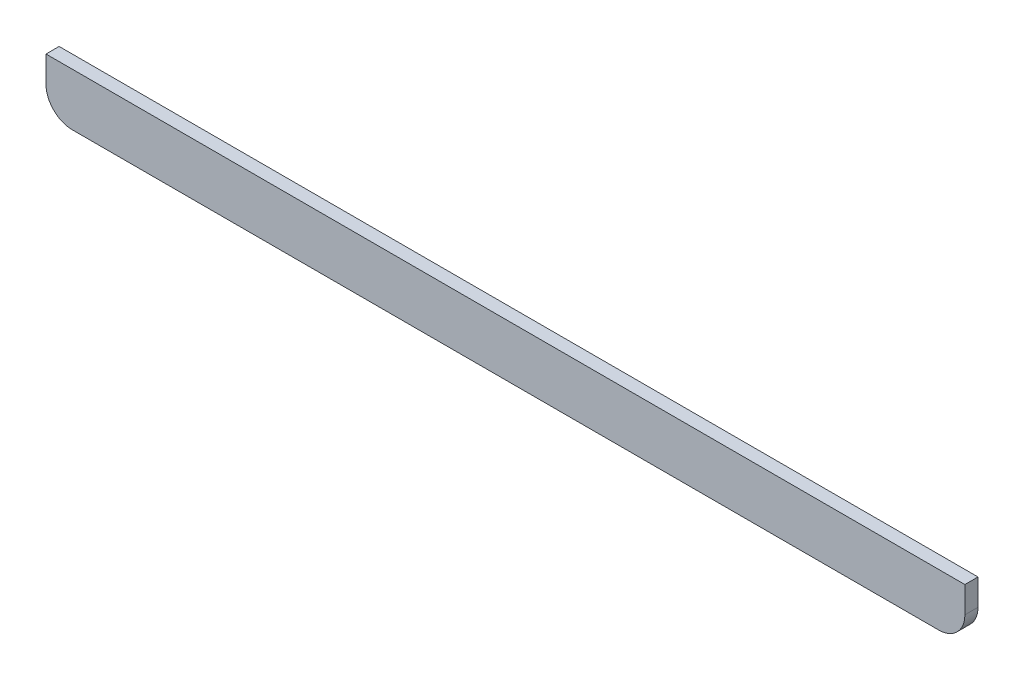
ISO-10303-21;
HEADER;
FILE_DESCRIPTION(('STEP AP214'),'2;1');
FILE_NAME('part.step','',(''),(''),'','','');
FILE_SCHEMA(('AUTOMOTIVE_DESIGN { 1 0 10303 214 1 1 1 1 }'));
ENDSEC;
DATA;
#1=APPLICATION_CONTEXT('core data for automotive mechanical design processes');
#2=APPLICATION_PROTOCOL_DEFINITION('international standard','automotive_design',2000,#1);
#3=PRODUCT_CONTEXT('',#1,'mechanical');
#4=PRODUCT('Part','Part','',(#3));
#5=PRODUCT_RELATED_PRODUCT_CATEGORY('part','',(#4));
#6=PRODUCT_DEFINITION_FORMATION('','',#4);
#7=PRODUCT_DEFINITION_CONTEXT('part definition',#1,'design');
#8=PRODUCT_DEFINITION('design','',#6,#7);
#9=PRODUCT_DEFINITION_SHAPE('','',#8);
#10=(LENGTH_UNIT() NAMED_UNIT(*) SI_UNIT(.MILLI.,.METRE.));
#11=(NAMED_UNIT(*) PLANE_ANGLE_UNIT() SI_UNIT($,.RADIAN.));
#12=(NAMED_UNIT(*) SI_UNIT($,.STERADIAN.) SOLID_ANGLE_UNIT());
#13=UNCERTAINTY_MEASURE_WITH_UNIT(LENGTH_MEASURE(1.E-05),#10,'distance_accuracy_value','');
#14=(GEOMETRIC_REPRESENTATION_CONTEXT(3) GLOBAL_UNCERTAINTY_ASSIGNED_CONTEXT((#13)) GLOBAL_UNIT_ASSIGNED_CONTEXT((#10,
#11,#12)) REPRESENTATION_CONTEXT('',''));
#15=CARTESIAN_POINT('',(0.,0.,0.));
#16=DIRECTION('',(0.,0.,1.));
#17=DIRECTION('',(1.,0.,0.));
#18=AXIS2_PLACEMENT_3D('',#15,#16,#17);
#19=CARTESIAN_POINT('',(350.,10.0000000000001,5.));
#20=DIRECTION('',(-1.,0.,0.));
#21=DIRECTION('',(0.,0.,1.));
#22=AXIS2_PLACEMENT_3D('',#19,#20,#21);
#23=PLANE('',#22);
#24=DIRECTION('',(0.,1.,0.));
#25=VECTOR('',#24,1.);
#26=CARTESIAN_POINT('',(350.,10.0000000000001,0.));
#27=LINE('',#26,#25);
#28=CARTESIAN_POINT('',(350.,10.,0.));
#29=VERTEX_POINT('',#28);
#30=CARTESIAN_POINT('',(350.,20.,0.));
#31=VERTEX_POINT('',#30);
#32=EDGE_CURVE('E120',#29,#31,#27,.T.);
#33=ORIENTED_EDGE('',*,*,#32,.T.);
#34=DIRECTION('',(0.,0.,-1.));
#35=VECTOR('',#34,1.);
#36=CARTESIAN_POINT('',(350.,20.,5.));
#37=LINE('',#36,#35);
#38=CARTESIAN_POINT('',(350.,20.,5.));
#39=VERTEX_POINT('',#38);
#40=EDGE_CURVE('E11',#39,#31,#37,.T.);
#41=ORIENTED_EDGE('',*,*,#40,.F.);
#42=DIRECTION('',(0.,1.,0.));
#43=VECTOR('',#42,1.);
#44=CARTESIAN_POINT('',(350.,10.0000000000001,5.));
#45=LINE('',#44,#43);
#46=CARTESIAN_POINT('',(350.,10.,5.));
#47=VERTEX_POINT('',#46);
#48=EDGE_CURVE('E130',#47,#39,#45,.T.);
#49=ORIENTED_EDGE('',*,*,#48,.F.);
#50=DIRECTION('',(0.,0.,-1.));
#51=VECTOR('',#50,1.);
#52=CARTESIAN_POINT('',(350.,10.,5.));
#53=LINE('',#52,#51);
#54=EDGE_CURVE('E116',#47,#29,#53,.T.);
#55=ORIENTED_EDGE('',*,*,#54,.T.);
#56=EDGE_LOOP('',(#33,#41,#49,#55));
#57=FACE_BOUND('',#56,.T.);
#58=ADVANCED_FACE('F36',(#57),#23,.F.);
#59=CARTESIAN_POINT('',(0.,20.,5.));
#60=DIRECTION('',(0.,-1.,0.));
#61=DIRECTION('',(0.,0.,-1.));
#62=AXIS2_PLACEMENT_3D('',#59,#60,#61);
#63=PLANE('',#62);
#64=DIRECTION('',(-1.,0.,0.));
#65=VECTOR('',#64,1.);
#66=CARTESIAN_POINT('',(0.,20.,0.));
#67=LINE('',#66,#65);
#68=CARTESIAN_POINT('',(0.,20.,0.));
#69=VERTEX_POINT('',#68);
#70=EDGE_CURVE('E123',#31,#69,#67,.T.);
#71=ORIENTED_EDGE('',*,*,#70,.T.);
#72=DIRECTION('',(0.,0.,-1.));
#73=VECTOR('',#72,1.);
#74=CARTESIAN_POINT('',(0.,20.,5.));
#75=LINE('',#74,#73);
#76=CARTESIAN_POINT('',(0.,20.,5.));
#77=VERTEX_POINT('',#76);
#78=EDGE_CURVE('E44',#77,#69,#75,.T.);
#79=ORIENTED_EDGE('',*,*,#78,.F.);
#80=DIRECTION('',(-1.,0.,0.));
#81=VECTOR('',#80,1.);
#82=CARTESIAN_POINT('',(0.,20.,5.));
#83=LINE('',#82,#81);
#84=EDGE_CURVE('E89',#39,#77,#83,.T.);
#85=ORIENTED_EDGE('',*,*,#84,.F.);
#86=ORIENTED_EDGE('',*,*,#40,.T.);
#87=EDGE_LOOP('',(#71,#79,#85,#86));
#88=FACE_BOUND('',#87,.T.);
#89=ADVANCED_FACE('F154',(#88),#63,.F.);
#90=CARTESIAN_POINT('',(0.,10.0000000000001,5.));
#91=DIRECTION('',(1.,0.,0.));
#92=DIRECTION('',(0.,0.,-1.));
#93=AXIS2_PLACEMENT_3D('',#90,#91,#92);
#94=PLANE('',#93);
#95=DIRECTION('',(0.,-1.,0.));
#96=VECTOR('',#95,1.);
#97=CARTESIAN_POINT('',(0.,10.0000000000001,0.));
#98=LINE('',#97,#96);
#99=CARTESIAN_POINT('',(0.,10.0000000000001,0.));
#100=VERTEX_POINT('',#99);
#101=EDGE_CURVE('E125',#69,#100,#98,.T.);
#102=ORIENTED_EDGE('',*,*,#101,.T.);
#103=DIRECTION('',(0.,0.,-1.));
#104=VECTOR('',#103,1.);
#105=CARTESIAN_POINT('',(0.,10.0000000000001,5.));
#106=LINE('',#105,#104);
#107=CARTESIAN_POINT('',(0.,10.0000000000001,5.));
#108=VERTEX_POINT('',#107);
#109=EDGE_CURVE('E111',#108,#100,#106,.T.);
#110=ORIENTED_EDGE('',*,*,#109,.F.);
#111=DIRECTION('',(0.,-1.,0.));
#112=VECTOR('',#111,1.);
#113=CARTESIAN_POINT('',(0.,10.0000000000001,5.));
#114=LINE('',#113,#112);
#115=EDGE_CURVE('E102',#77,#108,#114,.T.);
#116=ORIENTED_EDGE('',*,*,#115,.F.);
#117=ORIENTED_EDGE('',*,*,#78,.T.);
#118=EDGE_LOOP('',(#102,#110,#116,#117));
#119=FACE_BOUND('',#118,.T.);
#120=ADVANCED_FACE('F136',(#119),#94,.F.);
#121=CARTESIAN_POINT('',(10.,10.,5.));
#122=DIRECTION('',(0.,0.,-1.));
#123=DIRECTION('',(-1.,0.,0.));
#124=AXIS2_PLACEMENT_3D('',#121,#122,#123);
#125=CYLINDRICAL_SURFACE('',#124,10.);
#126=CARTESIAN_POINT('',(10.,10.,0.));
#127=DIRECTION('',(0.,0.,1.));
#128=DIRECTION('',(-1.,0.,0.));
#129=AXIS2_PLACEMENT_3D('',#126,#127,#128);
#130=CIRCLE('',#129,10.);
#131=CARTESIAN_POINT('',(10.0000000000001,0.,0.));
#132=VERTEX_POINT('',#131);
#133=EDGE_CURVE('E110',#100,#132,#130,.T.);
#134=ORIENTED_EDGE('',*,*,#133,.T.);
#135=DIRECTION('',(0.,0.,-1.));
#136=VECTOR('',#135,1.);
#137=CARTESIAN_POINT('',(10.0000000000001,0.,5.));
#138=LINE('',#137,#136);
#139=CARTESIAN_POINT('',(10.0000000000001,0.,5.));
#140=VERTEX_POINT('',#139);
#141=EDGE_CURVE('E107',#140,#132,#138,.T.);
#142=ORIENTED_EDGE('',*,*,#141,.F.);
#143=CARTESIAN_POINT('',(10.,10.,5.));
#144=DIRECTION('',(0.,0.,1.));
#145=DIRECTION('',(-1.,0.,0.));
#146=AXIS2_PLACEMENT_3D('',#143,#144,#145);
#147=CIRCLE('',#146,10.);
#148=EDGE_CURVE('E96',#108,#140,#147,.T.);
#149=ORIENTED_EDGE('',*,*,#148,.F.);
#150=ORIENTED_EDGE('',*,*,#109,.T.);
#151=EDGE_LOOP('',(#134,#142,#149,#150));
#152=FACE_BOUND('',#151,.T.);
#153=ADVANCED_FACE('F108',(#152),#125,.T.);
#154=CARTESIAN_POINT('',(10.0000000000001,0.,5.));
#155=DIRECTION('',(0.,1.,0.));
#156=DIRECTION('',(0.,0.,1.));
#157=AXIS2_PLACEMENT_3D('',#154,#155,#156);
#158=PLANE('',#157);
#159=DIRECTION('',(1.,0.,0.));
#160=VECTOR('',#159,1.);
#161=CARTESIAN_POINT('',(10.0000000000001,0.,0.));
#162=LINE('',#161,#160);
#163=CARTESIAN_POINT('',(340.,0.,0.));
#164=VERTEX_POINT('',#163);
#165=EDGE_CURVE('E75',#132,#164,#162,.T.);
#166=ORIENTED_EDGE('',*,*,#165,.T.);
#167=DIRECTION('',(0.,0.,-1.));
#168=VECTOR('',#167,1.);
#169=CARTESIAN_POINT('',(340.,0.,5.));
#170=LINE('',#169,#168);
#171=CARTESIAN_POINT('',(340.,0.,5.));
#172=VERTEX_POINT('',#171);
#173=EDGE_CURVE('E112',#172,#164,#170,.T.);
#174=ORIENTED_EDGE('',*,*,#173,.F.);
#175=DIRECTION('',(1.,0.,0.));
#176=VECTOR('',#175,1.);
#177=CARTESIAN_POINT('',(10.0000000000001,0.,5.));
#178=LINE('',#177,#176);
#179=EDGE_CURVE('E100',#140,#172,#178,.T.);
#180=ORIENTED_EDGE('',*,*,#179,.F.);
#181=ORIENTED_EDGE('',*,*,#141,.T.);
#182=EDGE_LOOP('',(#166,#174,#180,#181));
#183=FACE_BOUND('',#182,.T.);
#184=ADVANCED_FACE('F114',(#183),#158,.F.);
#185=CARTESIAN_POINT('',(340.,10.,5.));
#186=DIRECTION('',(0.,0.,-1.));
#187=DIRECTION('',(-1.,0.,0.));
#188=AXIS2_PLACEMENT_3D('',#185,#186,#187);
#189=CYLINDRICAL_SURFACE('',#188,10.);
#190=CARTESIAN_POINT('',(340.,10.,0.));
#191=DIRECTION('',(0.,0.,1.));
#192=DIRECTION('',(1.,0.,0.));
#193=AXIS2_PLACEMENT_3D('',#190,#191,#192);
#194=CIRCLE('',#193,10.);
#195=EDGE_CURVE('E81',#164,#29,#194,.T.);
#196=ORIENTED_EDGE('',*,*,#195,.T.);
#197=ORIENTED_EDGE('',*,*,#54,.F.);
#198=CARTESIAN_POINT('',(340.,10.,5.));
#199=DIRECTION('',(0.,0.,1.));
#200=DIRECTION('',(1.,0.,0.));
#201=AXIS2_PLACEMENT_3D('',#198,#199,#200);
#202=CIRCLE('',#201,10.);
#203=EDGE_CURVE('E52',#172,#47,#202,.T.);
#204=ORIENTED_EDGE('',*,*,#203,.F.);
#205=ORIENTED_EDGE('',*,*,#173,.T.);
#206=EDGE_LOOP('',(#196,#197,#204,#205));
#207=FACE_BOUND('',#206,.T.);
#208=ADVANCED_FACE('F143',(#207),#189,.T.);
#209=CARTESIAN_POINT('',(10.,10.,5.));
#210=DIRECTION('',(0.,0.,-1.));
#211=DIRECTION('',(-1.,0.,0.));
#212=AXIS2_PLACEMENT_3D('',#209,#210,#211);
#213=PLANE('',#212);
#214=ORIENTED_EDGE('',*,*,#48,.T.);
#215=ORIENTED_EDGE('',*,*,#84,.T.);
#216=ORIENTED_EDGE('',*,*,#115,.T.);
#217=ORIENTED_EDGE('',*,*,#148,.T.);
#218=ORIENTED_EDGE('',*,*,#179,.T.);
#219=ORIENTED_EDGE('',*,*,#203,.T.);
#220=EDGE_LOOP('',(#214,#215,#216,#217,#218,#219));
#221=FACE_BOUND('',#220,.T.);
#222=ADVANCED_FACE('F98',(#221),#213,.F.);
#223=CARTESIAN_POINT('',(10.,10.,0.));
#224=DIRECTION('',(0.,0.,-1.));
#225=DIRECTION('',(-1.,0.,0.));
#226=AXIS2_PLACEMENT_3D('',#223,#224,#225);
#227=PLANE('',#226);
#228=ORIENTED_EDGE('',*,*,#32,.F.);
#229=ORIENTED_EDGE('',*,*,#195,.F.);
#230=ORIENTED_EDGE('',*,*,#165,.F.);
#231=ORIENTED_EDGE('',*,*,#133,.F.);
#232=ORIENTED_EDGE('',*,*,#101,.F.);
#233=ORIENTED_EDGE('',*,*,#70,.F.);
#234=EDGE_LOOP('',(#228,#229,#230,#231,#232,#233));
#235=FACE_BOUND('',#234,.T.);
#236=ADVANCED_FACE('F139',(#235),#227,.T.);
#237=CLOSED_SHELL('',(#58,#89,#120,#153,#184,#208,#222,#236));
#238=MANIFOLD_SOLID_BREP('B2',#237);
#239=ADVANCED_BREP_SHAPE_REPRESENTATION('',(#18,#238),#14);
#240=SHAPE_DEFINITION_REPRESENTATION(#9,#239);
ENDSEC;
END-ISO-10303-21;
